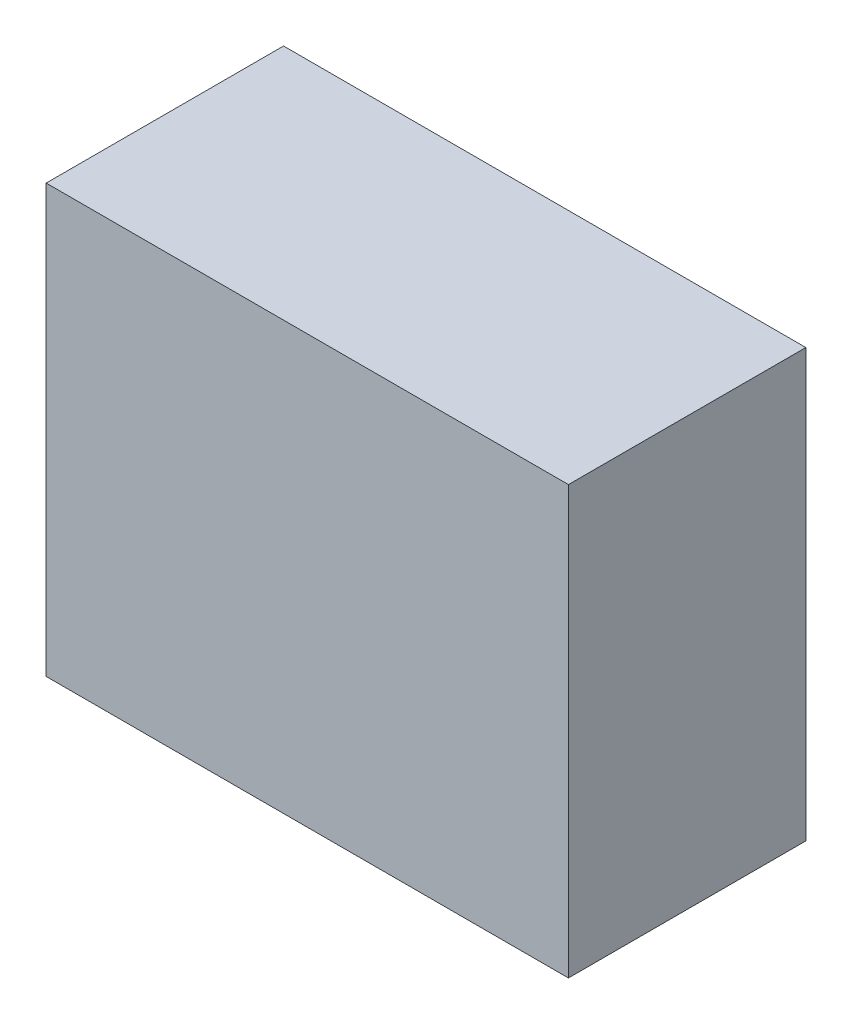
ISO-10303-21;
HEADER;
FILE_DESCRIPTION(('STEP AP214'),'2;1');
FILE_NAME('part.step','',(''),(''),'','','');
FILE_SCHEMA(('AUTOMOTIVE_DESIGN { 1 0 10303 214 1 1 1 1 }'));
ENDSEC;
DATA;
#1=APPLICATION_CONTEXT('core data for automotive mechanical design processes');
#2=APPLICATION_PROTOCOL_DEFINITION('international standard','automotive_design',2000,#1);
#3=PRODUCT_CONTEXT('',#1,'mechanical');
#4=PRODUCT('Part','Part','',(#3));
#5=PRODUCT_RELATED_PRODUCT_CATEGORY('part','',(#4));
#6=PRODUCT_DEFINITION_FORMATION('','',#4);
#7=PRODUCT_DEFINITION_CONTEXT('part definition',#1,'design');
#8=PRODUCT_DEFINITION('design','',#6,#7);
#9=PRODUCT_DEFINITION_SHAPE('','',#8);
#10=(LENGTH_UNIT() NAMED_UNIT(*) SI_UNIT(.MILLI.,.METRE.));
#11=(NAMED_UNIT(*) PLANE_ANGLE_UNIT() SI_UNIT($,.RADIAN.));
#12=(NAMED_UNIT(*) SI_UNIT($,.STERADIAN.) SOLID_ANGLE_UNIT());
#13=UNCERTAINTY_MEASURE_WITH_UNIT(LENGTH_MEASURE(1.E-05),#10,'distance_accuracy_value','');
#14=(GEOMETRIC_REPRESENTATION_CONTEXT(3) GLOBAL_UNCERTAINTY_ASSIGNED_CONTEXT((#13)) GLOBAL_UNIT_ASSIGNED_CONTEXT((#10,
#11,#12)) REPRESENTATION_CONTEXT('',''));
#15=CARTESIAN_POINT('',(0.,0.,0.));
#16=DIRECTION('',(0.,0.,1.));
#17=DIRECTION('',(1.,0.,0.));
#18=AXIS2_PLACEMENT_3D('',#15,#16,#17);
#19=CARTESIAN_POINT('',(104.775,85.725,95.25));
#20=DIRECTION('',(-1.,0.,0.));
#21=DIRECTION('',(0.,-1.,0.));
#22=AXIS2_PLACEMENT_3D('',#19,#20,#21);
#23=PLANE('',#22);
#24=DIRECTION('',(0.,1.,0.));
#25=VECTOR('',#24,1.);
#26=CARTESIAN_POINT('',(104.775,85.725,0.));
#27=LINE('',#26,#25);
#28=CARTESIAN_POINT('',(104.775,-85.725,0.));
#29=VERTEX_POINT('',#28);
#30=CARTESIAN_POINT('',(104.775,85.725,0.));
#31=VERTEX_POINT('',#30);
#32=EDGE_CURVE('E107',#29,#31,#27,.T.);
#33=ORIENTED_EDGE('',*,*,#32,.T.);
#34=DIRECTION('',(0.,0.,-1.));
#35=VECTOR('',#34,1.);
#36=CARTESIAN_POINT('',(104.775,85.725,95.25));
#37=LINE('',#36,#35);
#38=CARTESIAN_POINT('',(104.775,85.725,95.25));
#39=VERTEX_POINT('',#38);
#40=EDGE_CURVE('E11',#39,#31,#37,.T.);
#41=ORIENTED_EDGE('',*,*,#40,.F.);
#42=DIRECTION('',(0.,1.,0.));
#43=VECTOR('',#42,1.);
#44=CARTESIAN_POINT('',(104.775,85.725,95.25));
#45=LINE('',#44,#43);
#46=CARTESIAN_POINT('',(104.775,-85.725,95.25));
#47=VERTEX_POINT('',#46);
#48=EDGE_CURVE('E91',#47,#39,#45,.T.);
#49=ORIENTED_EDGE('',*,*,#48,.F.);
#50=DIRECTION('',(0.,0.,-1.));
#51=VECTOR('',#50,1.);
#52=CARTESIAN_POINT('',(104.775,-85.725,95.25));
#53=LINE('',#52,#51);
#54=EDGE_CURVE('E103',#47,#29,#53,.T.);
#55=ORIENTED_EDGE('',*,*,#54,.T.);
#56=EDGE_LOOP('',(#33,#41,#49,#55));
#57=FACE_BOUND('',#56,.T.);
#58=ADVANCED_FACE('F39',(#57),#23,.F.);
#59=CARTESIAN_POINT('',(-104.775,85.725,95.25));
#60=DIRECTION('',(0.,-1.,0.));
#61=DIRECTION('',(0.,0.,-1.));
#62=AXIS2_PLACEMENT_3D('',#59,#60,#61);
#63=PLANE('',#62);
#64=DIRECTION('',(-1.,0.,0.));
#65=VECTOR('',#64,1.);
#66=CARTESIAN_POINT('',(-104.775,85.725,0.));
#67=LINE('',#66,#65);
#68=CARTESIAN_POINT('',(-104.775,85.725,0.));
#69=VERTEX_POINT('',#68);
#70=EDGE_CURVE('E96',#31,#69,#67,.T.);
#71=ORIENTED_EDGE('',*,*,#70,.T.);
#72=DIRECTION('',(0.,0.,-1.));
#73=VECTOR('',#72,1.);
#74=CARTESIAN_POINT('',(-104.775,85.725,95.25));
#75=LINE('',#74,#73);
#76=CARTESIAN_POINT('',(-104.775,85.725,95.25));
#77=VERTEX_POINT('',#76);
#78=EDGE_CURVE('E48',#77,#69,#75,.T.);
#79=ORIENTED_EDGE('',*,*,#78,.F.);
#80=DIRECTION('',(-1.,0.,0.));
#81=VECTOR('',#80,1.);
#82=CARTESIAN_POINT('',(-104.775,85.725,95.25));
#83=LINE('',#82,#81);
#84=EDGE_CURVE('E86',#39,#77,#83,.T.);
#85=ORIENTED_EDGE('',*,*,#84,.F.);
#86=ORIENTED_EDGE('',*,*,#40,.T.);
#87=EDGE_LOOP('',(#71,#79,#85,#86));
#88=FACE_BOUND('',#87,.T.);
#89=ADVANCED_FACE('F95',(#88),#63,.F.);
#90=CARTESIAN_POINT('',(-104.775,85.725,95.25));
#91=DIRECTION('',(1.,0.,0.));
#92=DIRECTION('',(0.,1.,0.));
#93=AXIS2_PLACEMENT_3D('',#90,#91,#92);
#94=PLANE('',#93);
#95=DIRECTION('',(0.,-1.,0.));
#96=VECTOR('',#95,1.);
#97=CARTESIAN_POINT('',(-104.775,85.725,0.));
#98=LINE('',#97,#96);
#99=CARTESIAN_POINT('',(-104.775,-85.725,0.));
#100=VERTEX_POINT('',#99);
#101=EDGE_CURVE('E73',#69,#100,#98,.T.);
#102=ORIENTED_EDGE('',*,*,#101,.T.);
#103=DIRECTION('',(0.,0.,-1.));
#104=VECTOR('',#103,1.);
#105=CARTESIAN_POINT('',(-104.775,-85.725,95.25));
#106=LINE('',#105,#104);
#107=CARTESIAN_POINT('',(-104.775,-85.725,95.25));
#108=VERTEX_POINT('',#107);
#109=EDGE_CURVE('E98',#108,#100,#106,.T.);
#110=ORIENTED_EDGE('',*,*,#109,.F.);
#111=DIRECTION('',(0.,-1.,0.));
#112=VECTOR('',#111,1.);
#113=CARTESIAN_POINT('',(-104.775,85.725,95.25));
#114=LINE('',#113,#112);
#115=EDGE_CURVE('E89',#77,#108,#114,.T.);
#116=ORIENTED_EDGE('',*,*,#115,.F.);
#117=ORIENTED_EDGE('',*,*,#78,.T.);
#118=EDGE_LOOP('',(#102,#110,#116,#117));
#119=FACE_BOUND('',#118,.T.);
#120=ADVANCED_FACE('F99',(#119),#94,.F.);
#121=CARTESIAN_POINT('',(-104.775,-85.725,95.25));
#122=DIRECTION('',(0.,1.,0.));
#123=DIRECTION('',(0.,0.,1.));
#124=AXIS2_PLACEMENT_3D('',#121,#122,#123);
#125=PLANE('',#124);
#126=DIRECTION('',(1.,0.,0.));
#127=VECTOR('',#126,1.);
#128=CARTESIAN_POINT('',(-104.775,-85.725,0.));
#129=LINE('',#128,#127);
#130=EDGE_CURVE('E79',#100,#29,#129,.T.);
#131=ORIENTED_EDGE('',*,*,#130,.T.);
#132=ORIENTED_EDGE('',*,*,#54,.F.);
#133=DIRECTION('',(1.,0.,0.));
#134=VECTOR('',#133,1.);
#135=CARTESIAN_POINT('',(-104.775,-85.725,95.25));
#136=LINE('',#135,#134);
#137=EDGE_CURVE('E56',#108,#47,#136,.T.);
#138=ORIENTED_EDGE('',*,*,#137,.F.);
#139=ORIENTED_EDGE('',*,*,#109,.T.);
#140=EDGE_LOOP('',(#131,#132,#138,#139));
#141=FACE_BOUND('',#140,.T.);
#142=ADVANCED_FACE('F120',(#141),#125,.F.);
#143=CARTESIAN_POINT('',(0.,0.,95.25));
#144=DIRECTION('',(0.,0.,1.));
#145=DIRECTION('',(1.,0.,0.));
#146=AXIS2_PLACEMENT_3D('',#143,#144,#145);
#147=PLANE('',#146);
#148=ORIENTED_EDGE('',*,*,#48,.T.);
#149=ORIENTED_EDGE('',*,*,#84,.T.);
#150=ORIENTED_EDGE('',*,*,#115,.T.);
#151=ORIENTED_EDGE('',*,*,#137,.T.);
#152=EDGE_LOOP('',(#148,#149,#150,#151));
#153=FACE_BOUND('',#152,.T.);
#154=ADVANCED_FACE('F87',(#153),#147,.T.);
#155=CARTESIAN_POINT('',(0.,0.,0.));
#156=DIRECTION('',(0.,0.,1.));
#157=DIRECTION('',(1.,0.,0.));
#158=AXIS2_PLACEMENT_3D('',#155,#156,#157);
#159=PLANE('',#158);
#160=ORIENTED_EDGE('',*,*,#32,.F.);
#161=ORIENTED_EDGE('',*,*,#130,.F.);
#162=ORIENTED_EDGE('',*,*,#101,.F.);
#163=ORIENTED_EDGE('',*,*,#70,.F.);
#164=EDGE_LOOP('',(#160,#161,#162,#163));
#165=FACE_BOUND('',#164,.T.);
#166=ADVANCED_FACE('F123',(#165),#159,.F.);
#167=CLOSED_SHELL('',(#58,#89,#120,#142,#154,#166));
#168=MANIFOLD_SOLID_BREP('B2',#167);
#169=ADVANCED_BREP_SHAPE_REPRESENTATION('',(#18,#168),#14);
#170=SHAPE_DEFINITION_REPRESENTATION(#9,#169);
ENDSEC;
END-ISO-10303-21;
